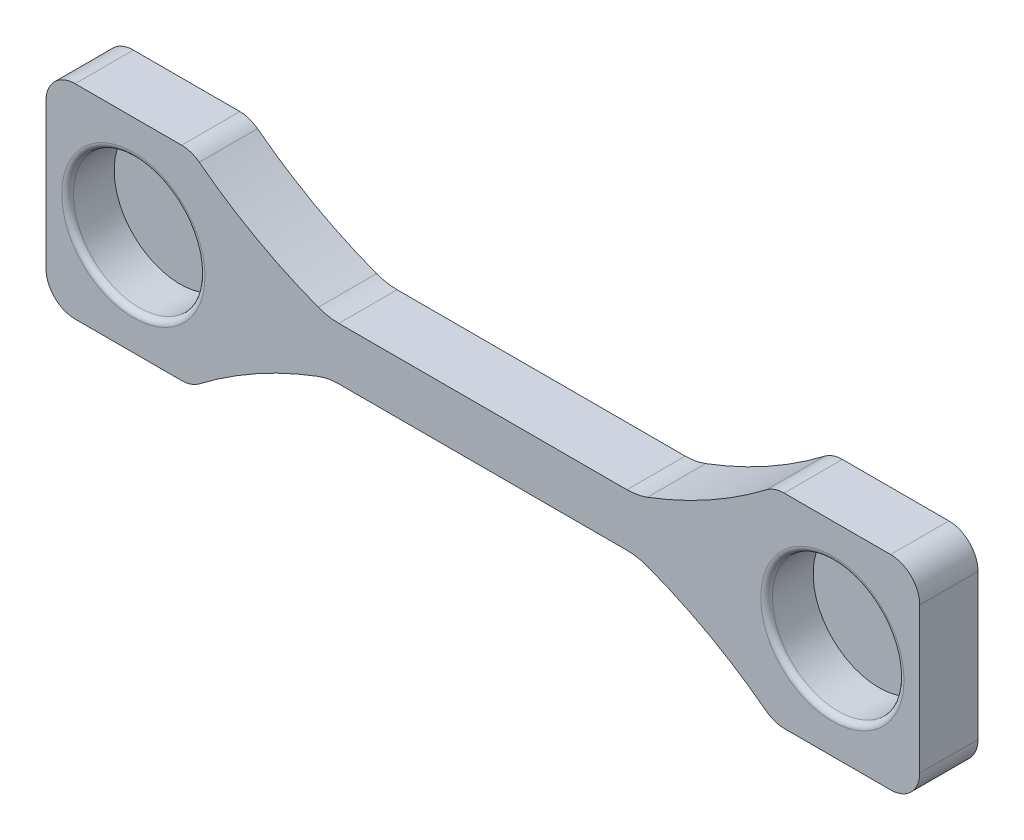
ISO-10303-21;
HEADER;
FILE_DESCRIPTION(('STEP AP214'),'2;1');
FILE_NAME('part.step','',(''),(''),'','','');
FILE_SCHEMA(('AUTOMOTIVE_DESIGN { 1 0 10303 214 1 1 1 1 }'));
ENDSEC;
DATA;
#1=APPLICATION_CONTEXT('core data for automotive mechanical design processes');
#2=APPLICATION_PROTOCOL_DEFINITION('international standard','automotive_design',2000,#1);
#3=PRODUCT_CONTEXT('',#1,'mechanical');
#4=PRODUCT('Part','Part','',(#3));
#5=PRODUCT_RELATED_PRODUCT_CATEGORY('part','',(#4));
#6=PRODUCT_DEFINITION_FORMATION('','',#4);
#7=PRODUCT_DEFINITION_CONTEXT('part definition',#1,'design');
#8=PRODUCT_DEFINITION('design','',#6,#7);
#9=PRODUCT_DEFINITION_SHAPE('','',#8);
#10=(LENGTH_UNIT() NAMED_UNIT(*) SI_UNIT(.MILLI.,.METRE.));
#11=(NAMED_UNIT(*) PLANE_ANGLE_UNIT() SI_UNIT($,.RADIAN.));
#12=(NAMED_UNIT(*) SI_UNIT($,.STERADIAN.) SOLID_ANGLE_UNIT());
#13=UNCERTAINTY_MEASURE_WITH_UNIT(LENGTH_MEASURE(1.E-05),#10,'distance_accuracy_value','');
#14=(GEOMETRIC_REPRESENTATION_CONTEXT(3) GLOBAL_UNCERTAINTY_ASSIGNED_CONTEXT((#13)) GLOBAL_UNIT_ASSIGNED_CONTEXT((#10,
#11,#12)) REPRESENTATION_CONTEXT('',''));
#15=CARTESIAN_POINT('',(0.,0.,0.));
#16=DIRECTION('',(0.,0.,1.));
#17=DIRECTION('',(1.,0.,0.));
#18=AXIS2_PLACEMENT_3D('',#15,#16,#17);
#19=CARTESIAN_POINT('',(0.,0.,10.));
#20=DIRECTION('',(0.,0.,1.));
#21=DIRECTION('',(1.,0.,0.));
#22=AXIS2_PLACEMENT_3D('',#19,#20,#21);
#23=PLANE('',#22);
#24=CARTESIAN_POINT('',(60.,0.,10.));
#25=DIRECTION('',(0.,0.,1.));
#26=DIRECTION('',(1.,0.,0.));
#27=AXIS2_PLACEMENT_3D('',#24,#25,#26);
#28=CIRCLE('',#27,12.3);
#29=CARTESIAN_POINT('',(72.3,0.,10.));
#30=VERTEX_POINT('',#29);
#31=EDGE_CURVE('E42',#30,#30,#28,.F.);
#32=ORIENTED_EDGE('',*,*,#31,.T.);
#33=EDGE_LOOP('',(#32));
#34=FACE_BOUND('',#33,.T.);
#35=CARTESIAN_POINT('',(-60.,0.,10.));
#36=DIRECTION('',(0.,0.,1.));
#37=DIRECTION('',(1.,0.,0.));
#38=AXIS2_PLACEMENT_3D('',#35,#36,#37);
#39=CIRCLE('',#38,12.3);
#40=CARTESIAN_POINT('',(-47.7,0.,10.));
#41=VERTEX_POINT('',#40);
#42=EDGE_CURVE('E388',#41,#41,#39,.F.);
#43=ORIENTED_EDGE('',*,*,#42,.T.);
#44=EDGE_LOOP('',(#43));
#45=FACE_BOUND('',#44,.T.);
#46=CARTESIAN_POINT('',(0.,80.1785714285714,10.));
#47=DIRECTION('',(0.,0.,1.));
#48=DIRECTION('',(1.,0.,0.));
#49=AXIS2_PLACEMENT_3D('',#46,#47,#48);
#50=CIRCLE('',#49,80.1785714285714);
#51=CARTESIAN_POINT('',(-28.2530006214216,5.14277149139154,10.));
#52=VERTEX_POINT('',#51);
#53=CARTESIAN_POINT('',(-48.6844037140679,16.4727463312369,10.));
#54=VERTEX_POINT('',#53);
#55=EDGE_CURVE('E237',#52,#54,#50,.F.);
#56=ORIENTED_EDGE('',*,*,#55,.T.);
#57=CARTESIAN_POINT('',(-51.720402163943,12.5,10.));
#58=DIRECTION('',(0.,0.,1.));
#59=DIRECTION('',(1.,0.,0.));
#60=AXIS2_PLACEMENT_3D('',#57,#58,#59);
#61=CIRCLE('',#60,5.);
#62=CARTESIAN_POINT('',(-51.720402163943,17.5,10.));
#63=VERTEX_POINT('',#62);
#64=EDGE_CURVE('E334',#54,#63,#61,.T.);
#65=ORIENTED_EDGE('',*,*,#64,.T.);
#66=DIRECTION('',(-1.,0.,0.));
#67=VECTOR('',#66,1.);
#68=CARTESIAN_POINT('',(75.,17.5,10.));
#69=LINE('',#68,#67);
#70=CARTESIAN_POINT('',(-70.,17.5,10.));
#71=VERTEX_POINT('',#70);
#72=EDGE_CURVE('E302',#63,#71,#69,.T.);
#73=ORIENTED_EDGE('',*,*,#72,.T.);
#74=CARTESIAN_POINT('',(-70.,12.5,10.));
#75=DIRECTION('',(0.,0.,1.));
#76=DIRECTION('',(1.,0.,0.));
#77=AXIS2_PLACEMENT_3D('',#74,#75,#76);
#78=CIRCLE('',#77,5.);
#79=CARTESIAN_POINT('',(-75.,12.5,10.));
#80=VERTEX_POINT('',#79);
#81=EDGE_CURVE('E322',#71,#80,#78,.T.);
#82=ORIENTED_EDGE('',*,*,#81,.T.);
#83=DIRECTION('',(0.,-1.,0.));
#84=VECTOR('',#83,1.);
#85=CARTESIAN_POINT('',(-75.,-17.5,10.));
#86=LINE('',#85,#84);
#87=CARTESIAN_POINT('',(-75.,-12.5,10.));
#88=VERTEX_POINT('',#87);
#89=EDGE_CURVE('E291',#80,#88,#86,.T.);
#90=ORIENTED_EDGE('',*,*,#89,.T.);
#91=CARTESIAN_POINT('',(-70.,-12.5,10.));
#92=DIRECTION('',(0.,0.,1.));
#93=DIRECTION('',(1.,0.,0.));
#94=AXIS2_PLACEMENT_3D('',#91,#92,#93);
#95=CIRCLE('',#94,5.);
#96=CARTESIAN_POINT('',(-70.,-17.5,10.));
#97=VERTEX_POINT('',#96);
#98=EDGE_CURVE('E320',#88,#97,#95,.T.);
#99=ORIENTED_EDGE('',*,*,#98,.T.);
#100=DIRECTION('',(1.,0.,0.));
#101=VECTOR('',#100,1.);
#102=CARTESIAN_POINT('',(75.,-17.5,10.));
#103=LINE('',#102,#101);
#104=CARTESIAN_POINT('',(-51.720402163943,-17.5,10.));
#105=VERTEX_POINT('',#104);
#106=EDGE_CURVE('E298',#97,#105,#103,.T.);
#107=ORIENTED_EDGE('',*,*,#106,.T.);
#108=CARTESIAN_POINT('',(-51.720402163943,-12.5,10.));
#109=DIRECTION('',(0.,0.,1.));
#110=DIRECTION('',(1.,0.,0.));
#111=AXIS2_PLACEMENT_3D('',#108,#109,#110);
#112=CIRCLE('',#111,5.);
#113=CARTESIAN_POINT('',(-48.684403714068,-16.4727463312369,10.));
#114=VERTEX_POINT('',#113);
#115=EDGE_CURVE('E332',#105,#114,#112,.T.);
#116=ORIENTED_EDGE('',*,*,#115,.T.);
#117=CARTESIAN_POINT('',(0.,-80.1785714285714,10.));
#118=DIRECTION('',(0.,0.,1.));
#119=DIRECTION('',(1.,0.,0.));
#120=AXIS2_PLACEMENT_3D('',#117,#118,#119);
#121=CIRCLE('',#120,80.1785714285714);
#122=CARTESIAN_POINT('',(-28.2530006214216,-5.14277149139156,10.));
#123=VERTEX_POINT('',#122);
#124=EDGE_CURVE('E266',#123,#114,#121,.T.);
#125=ORIENTED_EDGE('',*,*,#124,.F.);
#126=CARTESIAN_POINT('',(-24.729241078438,-14.5013567842247,10.));
#127=DIRECTION('',(0.,0.,1.));
#128=DIRECTION('',(1.,0.,0.));
#129=AXIS2_PLACEMENT_3D('',#126,#127,#128);
#130=CIRCLE('',#129,10.);
#131=CARTESIAN_POINT('',(-24.729241078438,-4.50135678422468,10.));
#132=VERTEX_POINT('',#131);
#133=EDGE_CURVE('E244',#132,#123,#130,.T.);
#134=ORIENTED_EDGE('',*,*,#133,.F.);
#135=DIRECTION('',(1.,0.,0.));
#136=VECTOR('',#135,1.);
#137=CARTESIAN_POINT('',(0.,-4.50135678422468,10.));
#138=LINE('',#137,#136);
#139=CARTESIAN_POINT('',(24.729241078438,-4.50135678422468,10.));
#140=VERTEX_POINT('',#139);
#141=EDGE_CURVE('E252',#132,#140,#138,.T.);
#142=ORIENTED_EDGE('',*,*,#141,.T.);
#143=CARTESIAN_POINT('',(24.729241078438,-14.5013567842247,10.));
#144=DIRECTION('',(0.,0.,1.));
#145=DIRECTION('',(1.,0.,0.));
#146=AXIS2_PLACEMENT_3D('',#143,#144,#145);
#147=CIRCLE('',#146,10.);
#148=CARTESIAN_POINT('',(28.2530006214216,-5.14277149139156,10.));
#149=VERTEX_POINT('',#148);
#150=EDGE_CURVE('E272',#149,#140,#147,.T.);
#151=ORIENTED_EDGE('',*,*,#150,.F.);
#152=CARTESIAN_POINT('',(0.,-80.1785714285714,10.));
#153=DIRECTION('',(0.,0.,1.));
#154=DIRECTION('',(1.,0.,0.));
#155=AXIS2_PLACEMENT_3D('',#152,#153,#154);
#156=CIRCLE('',#155,80.1785714285714);
#157=CARTESIAN_POINT('',(48.6844037140679,-16.4727463312369,10.));
#158=VERTEX_POINT('',#157);
#159=EDGE_CURVE('E269',#149,#158,#156,.F.);
#160=ORIENTED_EDGE('',*,*,#159,.T.);
#161=CARTESIAN_POINT('',(51.720402163943,-12.5,10.));
#162=DIRECTION('',(0.,0.,1.));
#163=DIRECTION('',(1.,0.,0.));
#164=AXIS2_PLACEMENT_3D('',#161,#162,#163);
#165=CIRCLE('',#164,5.);
#166=CARTESIAN_POINT('',(51.720402163943,-17.5,10.));
#167=VERTEX_POINT('',#166);
#168=EDGE_CURVE('E330',#158,#167,#165,.T.);
#169=ORIENTED_EDGE('',*,*,#168,.T.);
#170=CARTESIAN_POINT('',(70.,-17.5,10.));
#171=VERTEX_POINT('',#170);
#172=EDGE_CURVE('E294',#167,#171,#103,.T.);
#173=ORIENTED_EDGE('',*,*,#172,.T.);
#174=CARTESIAN_POINT('',(70.,-12.5,10.));
#175=DIRECTION('',(0.,0.,1.));
#176=DIRECTION('',(1.,0.,0.));
#177=AXIS2_PLACEMENT_3D('',#174,#175,#176);
#178=CIRCLE('',#177,5.);
#179=CARTESIAN_POINT('',(75.,-12.5,10.));
#180=VERTEX_POINT('',#179);
#181=EDGE_CURVE('E324',#171,#180,#178,.T.);
#182=ORIENTED_EDGE('',*,*,#181,.T.);
#183=DIRECTION('',(0.,1.,0.));
#184=VECTOR('',#183,1.);
#185=CARTESIAN_POINT('',(75.,-17.5,10.));
#186=LINE('',#185,#184);
#187=CARTESIAN_POINT('',(75.,12.5,10.));
#188=VERTEX_POINT('',#187);
#189=EDGE_CURVE('E299',#180,#188,#186,.T.);
#190=ORIENTED_EDGE('',*,*,#189,.T.);
#191=CARTESIAN_POINT('',(70.,12.5,10.));
#192=DIRECTION('',(0.,0.,1.));
#193=DIRECTION('',(1.,0.,0.));
#194=AXIS2_PLACEMENT_3D('',#191,#192,#193);
#195=CIRCLE('',#194,5.);
#196=CARTESIAN_POINT('',(70.,17.5,10.));
#197=VERTEX_POINT('',#196);
#198=EDGE_CURVE('E326',#188,#197,#195,.T.);
#199=ORIENTED_EDGE('',*,*,#198,.T.);
#200=CARTESIAN_POINT('',(51.720402163943,17.5,10.));
#201=VERTEX_POINT('',#200);
#202=EDGE_CURVE('E303',#197,#201,#69,.T.);
#203=ORIENTED_EDGE('',*,*,#202,.T.);
#204=CARTESIAN_POINT('',(51.720402163943,12.5,10.));
#205=DIRECTION('',(0.,0.,1.));
#206=DIRECTION('',(1.,0.,0.));
#207=AXIS2_PLACEMENT_3D('',#204,#205,#206);
#208=CIRCLE('',#207,5.);
#209=CARTESIAN_POINT('',(48.6844037140679,16.4727463312369,10.));
#210=VERTEX_POINT('',#209);
#211=EDGE_CURVE('E328',#201,#210,#208,.T.);
#212=ORIENTED_EDGE('',*,*,#211,.T.);
#213=CARTESIAN_POINT('',(0.,80.1785714285714,10.));
#214=DIRECTION('',(0.,0.,1.));
#215=DIRECTION('',(1.,0.,0.));
#216=AXIS2_PLACEMENT_3D('',#213,#214,#215);
#217=CIRCLE('',#216,80.1785714285714);
#218=CARTESIAN_POINT('',(28.2530006214215,5.14277149139154,10.));
#219=VERTEX_POINT('',#218);
#220=EDGE_CURVE('E235',#219,#210,#217,.T.);
#221=ORIENTED_EDGE('',*,*,#220,.F.);
#222=CARTESIAN_POINT('',(24.729241078438,14.5013567842247,10.));
#223=DIRECTION('',(0.,0.,1.));
#224=DIRECTION('',(1.,0.,0.));
#225=AXIS2_PLACEMENT_3D('',#222,#223,#224);
#226=CIRCLE('',#225,10.);
#227=CARTESIAN_POINT('',(24.729241078438,4.50135678422468,10.));
#228=VERTEX_POINT('',#227);
#229=EDGE_CURVE('E203',#219,#228,#226,.F.);
#230=ORIENTED_EDGE('',*,*,#229,.T.);
#231=DIRECTION('',(1.,0.,0.));
#232=VECTOR('',#231,1.);
#233=CARTESIAN_POINT('',(0.,4.50135678422468,10.));
#234=LINE('',#233,#232);
#235=CARTESIAN_POINT('',(-24.729241078438,4.50135678422468,10.));
#236=VERTEX_POINT('',#235);
#237=EDGE_CURVE('E223',#236,#228,#234,.T.);
#238=ORIENTED_EDGE('',*,*,#237,.F.);
#239=CARTESIAN_POINT('',(-24.729241078438,14.5013567842247,10.));
#240=DIRECTION('',(0.,0.,1.));
#241=DIRECTION('',(1.,0.,0.));
#242=AXIS2_PLACEMENT_3D('',#239,#240,#241);
#243=CIRCLE('',#242,10.);
#244=EDGE_CURVE('E226',#236,#52,#243,.F.);
#245=ORIENTED_EDGE('',*,*,#244,.T.);
#246=EDGE_LOOP('',(#56,#65,#73,#82,#90,#99,#107,#116,#125,#134,#142,#151,#160,#169,#173,#182,
#190,#199,#203,#212,#221,#230,#238,#245));
#247=FACE_BOUND('',#246,.T.);
#248=ADVANCED_FACE('F34',(#34,#45,#247),#23,.T.);
#249=CARTESIAN_POINT('',(0.,0.,0.));
#250=DIRECTION('',(0.,0.,1.));
#251=DIRECTION('',(1.,0.,0.));
#252=AXIS2_PLACEMENT_3D('',#249,#250,#251);
#253=PLANE('',#252);
#254=DIRECTION('',(-1.,0.,0.));
#255=VECTOR('',#254,1.);
#256=CARTESIAN_POINT('',(75.,17.5,0.));
#257=LINE('',#256,#255);
#258=CARTESIAN_POINT('',(-51.720402163943,17.5,0.));
#259=VERTEX_POINT('',#258);
#260=CARTESIAN_POINT('',(-70.,17.5,0.));
#261=VERTEX_POINT('',#260);
#262=EDGE_CURVE('E315',#259,#261,#257,.T.);
#263=ORIENTED_EDGE('',*,*,#262,.F.);
#264=CARTESIAN_POINT('',(-51.720402163943,12.5,0.));
#265=DIRECTION('',(0.,0.,1.));
#266=DIRECTION('',(1.,0.,0.));
#267=AXIS2_PLACEMENT_3D('',#264,#265,#266);
#268=CIRCLE('',#267,5.);
#269=CARTESIAN_POINT('',(-48.6844037140679,16.4727463312369,0.));
#270=VERTEX_POINT('',#269);
#271=EDGE_CURVE('E352',#259,#270,#268,.F.);
#272=ORIENTED_EDGE('',*,*,#271,.T.);
#273=CARTESIAN_POINT('',(0.,80.1785714285714,0.));
#274=DIRECTION('',(0.,0.,1.));
#275=DIRECTION('',(1.,0.,0.));
#276=AXIS2_PLACEMENT_3D('',#273,#274,#275);
#277=CIRCLE('',#276,80.1785714285714);
#278=CARTESIAN_POINT('',(-28.2530006214216,5.14277149139154,0.));
#279=VERTEX_POINT('',#278);
#280=EDGE_CURVE('E216',#279,#270,#277,.F.);
#281=ORIENTED_EDGE('',*,*,#280,.F.);
#282=CARTESIAN_POINT('',(-24.729241078438,14.5013567842247,0.));
#283=DIRECTION('',(0.,0.,1.));
#284=DIRECTION('',(1.,0.,0.));
#285=AXIS2_PLACEMENT_3D('',#282,#283,#284);
#286=CIRCLE('',#285,10.);
#287=CARTESIAN_POINT('',(-24.729241078438,4.50135678422468,0.));
#288=VERTEX_POINT('',#287);
#289=EDGE_CURVE('E231',#288,#279,#286,.F.);
#290=ORIENTED_EDGE('',*,*,#289,.F.);
#291=DIRECTION('',(1.,0.,0.));
#292=VECTOR('',#291,1.);
#293=CARTESIAN_POINT('',(0.,4.50135678422468,0.));
#294=LINE('',#293,#292);
#295=CARTESIAN_POINT('',(24.729241078438,4.50135678422468,0.));
#296=VERTEX_POINT('',#295);
#297=EDGE_CURVE('E208',#288,#296,#294,.T.);
#298=ORIENTED_EDGE('',*,*,#297,.T.);
#299=CARTESIAN_POINT('',(24.729241078438,14.5013567842247,0.));
#300=DIRECTION('',(0.,0.,1.));
#301=DIRECTION('',(1.,0.,0.));
#302=AXIS2_PLACEMENT_3D('',#299,#300,#301);
#303=CIRCLE('',#302,10.);
#304=CARTESIAN_POINT('',(28.2530006214215,5.14277149139154,0.));
#305=VERTEX_POINT('',#304);
#306=EDGE_CURVE('E200',#305,#296,#303,.F.);
#307=ORIENTED_EDGE('',*,*,#306,.F.);
#308=CARTESIAN_POINT('',(0.,80.1785714285714,0.));
#309=DIRECTION('',(0.,0.,1.));
#310=DIRECTION('',(1.,0.,0.));
#311=AXIS2_PLACEMENT_3D('',#308,#309,#310);
#312=CIRCLE('',#311,80.1785714285714);
#313=CARTESIAN_POINT('',(48.6844037140679,16.4727463312369,0.));
#314=VERTEX_POINT('',#313);
#315=EDGE_CURVE('E211',#305,#314,#312,.T.);
#316=ORIENTED_EDGE('',*,*,#315,.T.);
#317=CARTESIAN_POINT('',(51.720402163943,12.5,0.));
#318=DIRECTION('',(0.,0.,1.));
#319=DIRECTION('',(1.,0.,0.));
#320=AXIS2_PLACEMENT_3D('',#317,#318,#319);
#321=CIRCLE('',#320,5.);
#322=CARTESIAN_POINT('',(51.720402163943,17.5,0.));
#323=VERTEX_POINT('',#322);
#324=EDGE_CURVE('E346',#314,#323,#321,.F.);
#325=ORIENTED_EDGE('',*,*,#324,.T.);
#326=CARTESIAN_POINT('',(70.,17.5,0.));
#327=VERTEX_POINT('',#326);
#328=EDGE_CURVE('E295',#327,#323,#257,.T.);
#329=ORIENTED_EDGE('',*,*,#328,.F.);
#330=CARTESIAN_POINT('',(70.,12.5,0.));
#331=DIRECTION('',(0.,0.,1.));
#332=DIRECTION('',(1.,0.,0.));
#333=AXIS2_PLACEMENT_3D('',#330,#331,#332);
#334=CIRCLE('',#333,5.);
#335=CARTESIAN_POINT('',(75.,12.5,0.));
#336=VERTEX_POINT('',#335);
#337=EDGE_CURVE('E344',#327,#336,#334,.F.);
#338=ORIENTED_EDGE('',*,*,#337,.T.);
#339=DIRECTION('',(0.,1.,0.));
#340=VECTOR('',#339,1.);
#341=CARTESIAN_POINT('',(75.,-17.5,0.));
#342=LINE('',#341,#340);
#343=CARTESIAN_POINT('',(75.,-12.5,0.));
#344=VERTEX_POINT('',#343);
#345=EDGE_CURVE('E312',#344,#336,#342,.T.);
#346=ORIENTED_EDGE('',*,*,#345,.F.);
#347=CARTESIAN_POINT('',(70.,-12.5,0.));
#348=DIRECTION('',(0.,0.,1.));
#349=DIRECTION('',(1.,0.,0.));
#350=AXIS2_PLACEMENT_3D('',#347,#348,#349);
#351=CIRCLE('',#350,5.);
#352=CARTESIAN_POINT('',(70.,-17.5,0.));
#353=VERTEX_POINT('',#352);
#354=EDGE_CURVE('E342',#344,#353,#351,.F.);
#355=ORIENTED_EDGE('',*,*,#354,.T.);
#356=DIRECTION('',(1.,0.,0.));
#357=VECTOR('',#356,1.);
#358=CARTESIAN_POINT('',(75.,-17.5,0.));
#359=LINE('',#358,#357);
#360=CARTESIAN_POINT('',(51.720402163943,-17.5,0.));
#361=VERTEX_POINT('',#360);
#362=EDGE_CURVE('E308',#361,#353,#359,.T.);
#363=ORIENTED_EDGE('',*,*,#362,.F.);
#364=CARTESIAN_POINT('',(51.720402163943,-12.5,0.));
#365=DIRECTION('',(0.,0.,1.));
#366=DIRECTION('',(1.,0.,0.));
#367=AXIS2_PLACEMENT_3D('',#364,#365,#366);
#368=CIRCLE('',#367,5.);
#369=CARTESIAN_POINT('',(48.6844037140679,-16.4727463312369,0.));
#370=VERTEX_POINT('',#369);
#371=EDGE_CURVE('E348',#361,#370,#368,.F.);
#372=ORIENTED_EDGE('',*,*,#371,.T.);
#373=CARTESIAN_POINT('',(0.,-80.1785714285714,0.));
#374=DIRECTION('',(0.,0.,1.));
#375=DIRECTION('',(1.,0.,0.));
#376=AXIS2_PLACEMENT_3D('',#373,#374,#375);
#377=CIRCLE('',#376,80.1785714285714);
#378=CARTESIAN_POINT('',(28.2530006214216,-5.14277149139156,0.));
#379=VERTEX_POINT('',#378);
#380=EDGE_CURVE('E255',#379,#370,#377,.F.);
#381=ORIENTED_EDGE('',*,*,#380,.F.);
#382=CARTESIAN_POINT('',(24.729241078438,-14.5013567842247,0.));
#383=DIRECTION('',(0.,0.,1.));
#384=DIRECTION('',(1.,0.,0.));
#385=AXIS2_PLACEMENT_3D('',#382,#383,#384);
#386=CIRCLE('',#385,10.);
#387=CARTESIAN_POINT('',(24.729241078438,-4.50135678422468,0.));
#388=VERTEX_POINT('',#387);
#389=EDGE_CURVE('E258',#379,#388,#386,.T.);
#390=ORIENTED_EDGE('',*,*,#389,.T.);
#391=DIRECTION('',(1.,0.,0.));
#392=VECTOR('',#391,1.);
#393=CARTESIAN_POINT('',(0.,-4.50135678422468,0.));
#394=LINE('',#393,#392);
#395=CARTESIAN_POINT('',(-24.729241078438,-4.50135678422468,0.));
#396=VERTEX_POINT('',#395);
#397=EDGE_CURVE('E261',#396,#388,#394,.T.);
#398=ORIENTED_EDGE('',*,*,#397,.F.);
#399=CARTESIAN_POINT('',(-24.729241078438,-14.5013567842247,0.));
#400=DIRECTION('',(0.,0.,1.));
#401=DIRECTION('',(1.,0.,0.));
#402=AXIS2_PLACEMENT_3D('',#399,#400,#401);
#403=CIRCLE('',#402,10.);
#404=CARTESIAN_POINT('',(-28.2530006214216,-5.14277149139156,0.));
#405=VERTEX_POINT('',#404);
#406=EDGE_CURVE('E248',#396,#405,#403,.T.);
#407=ORIENTED_EDGE('',*,*,#406,.T.);
#408=CARTESIAN_POINT('',(0.,-80.1785714285714,0.));
#409=DIRECTION('',(0.,0.,1.));
#410=DIRECTION('',(1.,0.,0.));
#411=AXIS2_PLACEMENT_3D('',#408,#409,#410);
#412=CIRCLE('',#411,80.1785714285714);
#413=CARTESIAN_POINT('',(-48.684403714068,-16.4727463312369,0.));
#414=VERTEX_POINT('',#413);
#415=EDGE_CURVE('E251',#405,#414,#412,.T.);
#416=ORIENTED_EDGE('',*,*,#415,.T.);
#417=CARTESIAN_POINT('',(-51.720402163943,-12.5,0.));
#418=DIRECTION('',(0.,0.,1.));
#419=DIRECTION('',(1.,0.,0.));
#420=AXIS2_PLACEMENT_3D('',#417,#418,#419);
#421=CIRCLE('',#420,5.);
#422=CARTESIAN_POINT('',(-51.720402163943,-17.5,0.));
#423=VERTEX_POINT('',#422);
#424=EDGE_CURVE('E350',#414,#423,#421,.F.);
#425=ORIENTED_EDGE('',*,*,#424,.T.);
#426=CARTESIAN_POINT('',(-70.,-17.5,0.));
#427=VERTEX_POINT('',#426);
#428=EDGE_CURVE('E309',#427,#423,#359,.T.);
#429=ORIENTED_EDGE('',*,*,#428,.F.);
#430=CARTESIAN_POINT('',(-70.,-12.5,0.));
#431=DIRECTION('',(0.,0.,1.));
#432=DIRECTION('',(1.,0.,0.));
#433=AXIS2_PLACEMENT_3D('',#430,#431,#432);
#434=CIRCLE('',#433,5.);
#435=CARTESIAN_POINT('',(-75.,-12.5,0.));
#436=VERTEX_POINT('',#435);
#437=EDGE_CURVE('E49',#427,#436,#434,.F.);
#438=ORIENTED_EDGE('',*,*,#437,.T.);
#439=DIRECTION('',(0.,-1.,0.));
#440=VECTOR('',#439,1.);
#441=CARTESIAN_POINT('',(-75.,-17.5,0.));
#442=LINE('',#441,#440);
#443=CARTESIAN_POINT('',(-75.,12.5,0.));
#444=VERTEX_POINT('',#443);
#445=EDGE_CURVE('E290',#444,#436,#442,.T.);
#446=ORIENTED_EDGE('',*,*,#445,.F.);
#447=CARTESIAN_POINT('',(-70.,12.5,0.));
#448=DIRECTION('',(0.,0.,1.));
#449=DIRECTION('',(1.,0.,0.));
#450=AXIS2_PLACEMENT_3D('',#447,#448,#449);
#451=CIRCLE('',#450,5.);
#452=EDGE_CURVE('E57',#444,#261,#451,.F.);
#453=ORIENTED_EDGE('',*,*,#452,.T.);
#454=EDGE_LOOP('',(#263,#272,#281,#290,#298,#307,#316,#325,#329,#338,#346,#355,#363,#372,#381,
#390,#398,#407,#416,#425,#429,#438,#446,#453));
#455=FACE_BOUND('',#454,.T.);
#456=ADVANCED_FACE('F220',(#455),#253,.F.);
#457=CARTESIAN_POINT('',(75.,17.5,10.));
#458=DIRECTION('',(0.,-1.,0.));
#459=DIRECTION('',(1.,0.,0.));
#460=AXIS2_PLACEMENT_3D('',#457,#458,#459);
#461=PLANE('',#460);
#462=ORIENTED_EDGE('',*,*,#72,.F.);
#463=DIRECTION('',(0.,0.,-1.));
#464=VECTOR('',#463,1.);
#465=CARTESIAN_POINT('',(-51.720402163943,17.5,0.));
#466=LINE('',#465,#464);
#467=EDGE_CURVE('E338',#63,#259,#466,.T.);
#468=ORIENTED_EDGE('',*,*,#467,.T.);
#469=ORIENTED_EDGE('',*,*,#262,.T.);
#470=DIRECTION('',(0.,0.,-1.));
#471=VECTOR('',#470,1.);
#472=CARTESIAN_POINT('',(-70.,17.5,10.));
#473=LINE('',#472,#471);
#474=EDGE_CURVE('E336',#261,#71,#473,.F.);
#475=ORIENTED_EDGE('',*,*,#474,.T.);
#476=EDGE_LOOP('',(#462,#468,#469,#475));
#477=FACE_BOUND('',#476,.T.);
#478=ADVANCED_FACE('F425',(#477),#461,.F.);
#479=CARTESIAN_POINT('',(75.,-17.5,10.));
#480=DIRECTION('',(0.,1.,0.));
#481=DIRECTION('',(-1.,0.,0.));
#482=AXIS2_PLACEMENT_3D('',#479,#480,#481);
#483=PLANE('',#482);
#484=ORIENTED_EDGE('',*,*,#172,.F.);
#485=DIRECTION('',(0.,0.,-1.));
#486=VECTOR('',#485,1.);
#487=CARTESIAN_POINT('',(51.720402163943,-17.5,0.));
#488=LINE('',#487,#486);
#489=EDGE_CURVE('E367',#167,#361,#488,.T.);
#490=ORIENTED_EDGE('',*,*,#489,.T.);
#491=ORIENTED_EDGE('',*,*,#362,.T.);
#492=DIRECTION('',(0.,0.,-1.));
#493=VECTOR('',#492,1.);
#494=CARTESIAN_POINT('',(70.,-17.5,10.));
#495=LINE('',#494,#493);
#496=EDGE_CURVE('E365',#353,#171,#495,.F.);
#497=ORIENTED_EDGE('',*,*,#496,.T.);
#498=EDGE_LOOP('',(#484,#490,#491,#497));
#499=FACE_BOUND('',#498,.T.);
#500=ADVANCED_FACE('F444',(#499),#483,.F.);
#501=CARTESIAN_POINT('',(-75.,-17.5,10.));
#502=DIRECTION('',(1.,0.,0.));
#503=DIRECTION('',(0.,0.,-1.));
#504=AXIS2_PLACEMENT_3D('',#501,#502,#503);
#505=PLANE('',#504);
#506=ORIENTED_EDGE('',*,*,#89,.F.);
#507=DIRECTION('',(0.,0.,-1.));
#508=VECTOR('',#507,1.);
#509=CARTESIAN_POINT('',(-75.,12.5,10.));
#510=LINE('',#509,#508);
#511=EDGE_CURVE('E383',#80,#444,#510,.T.);
#512=ORIENTED_EDGE('',*,*,#511,.T.);
#513=ORIENTED_EDGE('',*,*,#445,.T.);
#514=DIRECTION('',(0.,0.,-1.));
#515=VECTOR('',#514,1.);
#516=CARTESIAN_POINT('',(-75.,-12.5,10.));
#517=LINE('',#516,#515);
#518=EDGE_CURVE('E381',#436,#88,#517,.F.);
#519=ORIENTED_EDGE('',*,*,#518,.T.);
#520=EDGE_LOOP('',(#506,#512,#513,#519));
#521=FACE_BOUND('',#520,.T.);
#522=ADVANCED_FACE('F442',(#521),#505,.F.);
#523=ORIENTED_EDGE('',*,*,#428,.T.);
#524=DIRECTION('',(0.,0.,1.));
#525=VECTOR('',#524,1.);
#526=CARTESIAN_POINT('',(-51.720402163943,-17.5,10.));
#527=LINE('',#526,#525);
#528=EDGE_CURVE('E357',#423,#105,#527,.T.);
#529=ORIENTED_EDGE('',*,*,#528,.T.);
#530=ORIENTED_EDGE('',*,*,#106,.F.);
#531=DIRECTION('',(0.,0.,-1.));
#532=VECTOR('',#531,1.);
#533=CARTESIAN_POINT('',(-70.,-17.5,10.));
#534=LINE('',#533,#532);
#535=EDGE_CURVE('E354',#97,#427,#534,.T.);
#536=ORIENTED_EDGE('',*,*,#535,.T.);
#537=EDGE_LOOP('',(#523,#529,#530,#536));
#538=FACE_BOUND('',#537,.T.);
#539=ADVANCED_FACE('F438',(#538),#483,.F.);
#540=CARTESIAN_POINT('',(75.,-17.5,10.));
#541=DIRECTION('',(-1.,0.,0.));
#542=DIRECTION('',(0.,0.,1.));
#543=AXIS2_PLACEMENT_3D('',#540,#541,#542);
#544=PLANE('',#543);
#545=ORIENTED_EDGE('',*,*,#345,.T.);
#546=DIRECTION('',(0.,0.,-1.));
#547=VECTOR('',#546,1.);
#548=CARTESIAN_POINT('',(75.,12.5,10.));
#549=LINE('',#548,#547);
#550=EDGE_CURVE('E379',#336,#188,#549,.F.);
#551=ORIENTED_EDGE('',*,*,#550,.T.);
#552=ORIENTED_EDGE('',*,*,#189,.F.);
#553=DIRECTION('',(0.,0.,-1.));
#554=VECTOR('',#553,1.);
#555=CARTESIAN_POINT('',(75.,-12.5,10.));
#556=LINE('',#555,#554);
#557=EDGE_CURVE('E376',#180,#344,#556,.T.);
#558=ORIENTED_EDGE('',*,*,#557,.T.);
#559=EDGE_LOOP('',(#545,#551,#552,#558));
#560=FACE_BOUND('',#559,.T.);
#561=ADVANCED_FACE('F434',(#560),#544,.F.);
#562=ORIENTED_EDGE('',*,*,#328,.T.);
#563=DIRECTION('',(0.,0.,1.));
#564=VECTOR('',#563,1.);
#565=CARTESIAN_POINT('',(51.720402163943,17.5,10.));
#566=LINE('',#565,#564);
#567=EDGE_CURVE('E372',#323,#201,#566,.T.);
#568=ORIENTED_EDGE('',*,*,#567,.T.);
#569=ORIENTED_EDGE('',*,*,#202,.F.);
#570=DIRECTION('',(0.,0.,-1.));
#571=VECTOR('',#570,1.);
#572=CARTESIAN_POINT('',(70.,17.5,10.));
#573=LINE('',#572,#571);
#574=EDGE_CURVE('E369',#197,#327,#573,.T.);
#575=ORIENTED_EDGE('',*,*,#574,.T.);
#576=EDGE_LOOP('',(#562,#568,#569,#575));
#577=FACE_BOUND('',#576,.T.);
#578=ADVANCED_FACE('F431',(#577),#461,.F.);
#579=CARTESIAN_POINT('',(-60.,0.,2.));
#580=DIRECTION('',(0.,0.,1.));
#581=DIRECTION('',(1.,0.,0.));
#582=AXIS2_PLACEMENT_3D('',#579,#580,#581);
#583=CYLINDRICAL_SURFACE('',#582,11.3);
#584=CARTESIAN_POINT('',(-60.,0.,9.));
#585=DIRECTION('',(0.,0.,1.));
#586=DIRECTION('',(1.,0.,0.));
#587=AXIS2_PLACEMENT_3D('',#584,#585,#586);
#588=CIRCLE('',#587,11.3);
#589=CARTESIAN_POINT('',(-48.7,0.,9.));
#590=VERTEX_POINT('',#589);
#591=EDGE_CURVE('E11',#590,#590,#588,.T.);
#592=ORIENTED_EDGE('',*,*,#591,.T.);
#593=EDGE_LOOP('',(#592));
#594=FACE_BOUND('',#593,.T.);
#595=CARTESIAN_POINT('',(-60.,0.,2.));
#596=DIRECTION('',(0.,0.,1.));
#597=DIRECTION('',(1.,0.,0.));
#598=AXIS2_PLACEMENT_3D('',#595,#596,#597);
#599=CIRCLE('',#598,11.3);
#600=CARTESIAN_POINT('',(-48.7,0.,2.));
#601=VERTEX_POINT('',#600);
#602=EDGE_CURVE('E287',#601,#601,#599,.T.);
#603=ORIENTED_EDGE('',*,*,#602,.F.);
#604=EDGE_LOOP('',(#603));
#605=FACE_BOUND('',#604,.T.);
#606=ADVANCED_FACE('F428',(#594,#605),#583,.F.);
#607=CARTESIAN_POINT('',(-60.,0.,2.));
#608=DIRECTION('',(0.,0.,1.));
#609=DIRECTION('',(1.,0.,0.));
#610=AXIS2_PLACEMENT_3D('',#607,#608,#609);
#611=PLANE('',#610);
#612=ORIENTED_EDGE('',*,*,#602,.T.);
#613=EDGE_LOOP('',(#612));
#614=FACE_BOUND('',#613,.T.);
#615=ADVANCED_FACE('F405',(#614),#611,.T.);
#616=CARTESIAN_POINT('',(60.,0.,2.));
#617=DIRECTION('',(0.,0.,1.));
#618=DIRECTION('',(1.,0.,0.));
#619=AXIS2_PLACEMENT_3D('',#616,#617,#618);
#620=CYLINDRICAL_SURFACE('',#619,11.3);
#621=CARTESIAN_POINT('',(60.,0.,9.));
#622=DIRECTION('',(0.,0.,1.));
#623=DIRECTION('',(1.,0.,0.));
#624=AXIS2_PLACEMENT_3D('',#621,#622,#623);
#625=CIRCLE('',#624,11.3);
#626=CARTESIAN_POINT('',(71.3,0.,9.));
#627=VERTEX_POINT('',#626);
#628=EDGE_CURVE('E385',#627,#627,#625,.T.);
#629=ORIENTED_EDGE('',*,*,#628,.T.);
#630=EDGE_LOOP('',(#629));
#631=FACE_BOUND('',#630,.T.);
#632=CARTESIAN_POINT('',(60.,0.,2.));
#633=DIRECTION('',(0.,0.,1.));
#634=DIRECTION('',(1.,0.,0.));
#635=AXIS2_PLACEMENT_3D('',#632,#633,#634);
#636=CIRCLE('',#635,11.3);
#637=CARTESIAN_POINT('',(71.3,0.,2.));
#638=VERTEX_POINT('',#637);
#639=EDGE_CURVE('E279',#638,#638,#636,.T.);
#640=ORIENTED_EDGE('',*,*,#639,.F.);
#641=EDGE_LOOP('',(#640));
#642=FACE_BOUND('',#641,.T.);
#643=ADVANCED_FACE('F401',(#631,#642),#620,.F.);
#644=CARTESIAN_POINT('',(60.,0.,2.));
#645=DIRECTION('',(0.,0.,1.));
#646=DIRECTION('',(1.,0.,0.));
#647=AXIS2_PLACEMENT_3D('',#644,#645,#646);
#648=PLANE('',#647);
#649=ORIENTED_EDGE('',*,*,#639,.T.);
#650=EDGE_LOOP('',(#649));
#651=FACE_BOUND('',#650,.T.);
#652=ADVANCED_FACE('F404',(#651),#648,.T.);
#653=CARTESIAN_POINT('',(-24.729241078438,-14.5013567842247,0.));
#654=DIRECTION('',(0.,0.,1.));
#655=DIRECTION('',(1.,0.,0.));
#656=AXIS2_PLACEMENT_3D('',#653,#654,#655);
#657=CYLINDRICAL_SURFACE('',#656,10.);
#658=ORIENTED_EDGE('',*,*,#133,.T.);
#659=DIRECTION('',(0.,0.,1.));
#660=VECTOR('',#659,1.);
#661=CARTESIAN_POINT('',(-28.2530006214216,-5.14277149139156,0.));
#662=LINE('',#661,#660);
#663=EDGE_CURVE('E263',#405,#123,#662,.T.);
#664=ORIENTED_EDGE('',*,*,#663,.F.);
#665=ORIENTED_EDGE('',*,*,#406,.F.);
#666=DIRECTION('',(0.,0.,1.));
#667=VECTOR('',#666,1.);
#668=CARTESIAN_POINT('',(-24.729241078438,-4.50135678422468,0.));
#669=LINE('',#668,#667);
#670=EDGE_CURVE('E277',#396,#132,#669,.T.);
#671=ORIENTED_EDGE('',*,*,#670,.T.);
#672=EDGE_LOOP('',(#658,#664,#665,#671));
#673=FACE_BOUND('',#672,.T.);
#674=ADVANCED_FACE('F410',(#673),#657,.F.);
#675=CARTESIAN_POINT('',(0.,-4.50135678422468,0.));
#676=DIRECTION('',(0.,-1.,0.));
#677=DIRECTION('',(0.,0.,-1.));
#678=AXIS2_PLACEMENT_3D('',#675,#676,#677);
#679=PLANE('',#678);
#680=ORIENTED_EDGE('',*,*,#141,.F.);
#681=ORIENTED_EDGE('',*,*,#670,.F.);
#682=ORIENTED_EDGE('',*,*,#397,.T.);
#683=DIRECTION('',(0.,0.,1.));
#684=VECTOR('',#683,1.);
#685=CARTESIAN_POINT('',(24.729241078438,-4.50135678422468,0.));
#686=LINE('',#685,#684);
#687=EDGE_CURVE('E280',#388,#140,#686,.T.);
#688=ORIENTED_EDGE('',*,*,#687,.T.);
#689=EDGE_LOOP('',(#680,#681,#682,#688));
#690=FACE_BOUND('',#689,.T.);
#691=ADVANCED_FACE('F415',(#690),#679,.T.);
#692=CARTESIAN_POINT('',(24.729241078438,-14.5013567842247,0.));
#693=DIRECTION('',(0.,0.,1.));
#694=DIRECTION('',(1.,0.,0.));
#695=AXIS2_PLACEMENT_3D('',#692,#693,#694);
#696=CYLINDRICAL_SURFACE('',#695,10.);
#697=ORIENTED_EDGE('',*,*,#150,.T.);
#698=ORIENTED_EDGE('',*,*,#687,.F.);
#699=ORIENTED_EDGE('',*,*,#389,.F.);
#700=DIRECTION('',(0.,0.,1.));
#701=VECTOR('',#700,1.);
#702=CARTESIAN_POINT('',(28.2530006214216,-5.14277149139156,0.));
#703=LINE('',#702,#701);
#704=EDGE_CURVE('E282',#379,#149,#703,.T.);
#705=ORIENTED_EDGE('',*,*,#704,.T.);
#706=EDGE_LOOP('',(#697,#698,#699,#705));
#707=FACE_BOUND('',#706,.T.);
#708=ADVANCED_FACE('F501',(#707),#696,.F.);
#709=CARTESIAN_POINT('',(0.,-80.1785714285714,0.));
#710=DIRECTION('',(0.,0.,1.));
#711=DIRECTION('',(1.,0.,0.));
#712=AXIS2_PLACEMENT_3D('',#709,#710,#711);
#713=CYLINDRICAL_SURFACE('',#712,80.1785714285714);
#714=ORIENTED_EDGE('',*,*,#380,.T.);
#715=DIRECTION('',(0.,0.,1.));
#716=VECTOR('',#715,1.);
#717=CARTESIAN_POINT('',(48.684403714068,-16.4727463312369,0.));
#718=LINE('',#717,#716);
#719=EDGE_CURVE('E362',#370,#158,#718,.T.);
#720=ORIENTED_EDGE('',*,*,#719,.T.);
#721=ORIENTED_EDGE('',*,*,#159,.F.);
#722=ORIENTED_EDGE('',*,*,#704,.F.);
#723=EDGE_LOOP('',(#714,#720,#721,#722));
#724=FACE_BOUND('',#723,.T.);
#725=ADVANCED_FACE('F505',(#724),#713,.F.);
#726=CARTESIAN_POINT('',(0.,-80.1785714285714,0.));
#727=DIRECTION('',(0.,0.,1.));
#728=DIRECTION('',(1.,0.,0.));
#729=AXIS2_PLACEMENT_3D('',#726,#727,#728);
#730=CYLINDRICAL_SURFACE('',#729,80.1785714285714);
#731=ORIENTED_EDGE('',*,*,#124,.T.);
#732=DIRECTION('',(0.,0.,1.));
#733=VECTOR('',#732,1.);
#734=CARTESIAN_POINT('',(-48.684403714068,-16.4727463312369,0.));
#735=LINE('',#734,#733);
#736=EDGE_CURVE('E360',#114,#414,#735,.F.);
#737=ORIENTED_EDGE('',*,*,#736,.T.);
#738=ORIENTED_EDGE('',*,*,#415,.F.);
#739=ORIENTED_EDGE('',*,*,#663,.T.);
#740=EDGE_LOOP('',(#731,#737,#738,#739));
#741=FACE_BOUND('',#740,.T.);
#742=ADVANCED_FACE('F491',(#741),#730,.F.);
#743=CARTESIAN_POINT('',(24.729241078438,14.5013567842247,0.));
#744=DIRECTION('',(0.,0.,1.));
#745=DIRECTION('',(1.,0.,0.));
#746=AXIS2_PLACEMENT_3D('',#743,#744,#745);
#747=CYLINDRICAL_SURFACE('',#746,10.);
#748=ORIENTED_EDGE('',*,*,#229,.F.);
#749=DIRECTION('',(0.,0.,1.));
#750=VECTOR('',#749,1.);
#751=CARTESIAN_POINT('',(28.2530006214215,5.14277149139154,0.));
#752=LINE('',#751,#750);
#753=EDGE_CURVE('E196',#305,#219,#752,.T.);
#754=ORIENTED_EDGE('',*,*,#753,.F.);
#755=ORIENTED_EDGE('',*,*,#306,.T.);
#756=DIRECTION('',(0.,0.,1.));
#757=VECTOR('',#756,1.);
#758=CARTESIAN_POINT('',(24.729241078438,4.50135678422468,0.));
#759=LINE('',#758,#757);
#760=EDGE_CURVE('E242',#296,#228,#759,.T.);
#761=ORIENTED_EDGE('',*,*,#760,.T.);
#762=EDGE_LOOP('',(#748,#754,#755,#761));
#763=FACE_BOUND('',#762,.T.);
#764=ADVANCED_FACE('F198',(#763),#747,.F.);
#765=CARTESIAN_POINT('',(0.,4.50135678422468,0.));
#766=DIRECTION('',(0.,-1.,0.));
#767=DIRECTION('',(0.,0.,-1.));
#768=AXIS2_PLACEMENT_3D('',#765,#766,#767);
#769=PLANE('',#768);
#770=ORIENTED_EDGE('',*,*,#237,.T.);
#771=ORIENTED_EDGE('',*,*,#760,.F.);
#772=ORIENTED_EDGE('',*,*,#297,.F.);
#773=DIRECTION('',(0.,0.,1.));
#774=VECTOR('',#773,1.);
#775=CARTESIAN_POINT('',(-24.729241078438,4.50135678422468,0.));
#776=LINE('',#775,#774);
#777=EDGE_CURVE('E245',#288,#236,#776,.T.);
#778=ORIENTED_EDGE('',*,*,#777,.T.);
#779=EDGE_LOOP('',(#770,#771,#772,#778));
#780=FACE_BOUND('',#779,.T.);
#781=ADVANCED_FACE('F527',(#780),#769,.F.);
#782=CARTESIAN_POINT('',(-24.729241078438,14.5013567842247,0.));
#783=DIRECTION('',(0.,0.,1.));
#784=DIRECTION('',(1.,0.,0.));
#785=AXIS2_PLACEMENT_3D('',#782,#783,#784);
#786=CYLINDRICAL_SURFACE('',#785,10.);
#787=ORIENTED_EDGE('',*,*,#244,.F.);
#788=ORIENTED_EDGE('',*,*,#777,.F.);
#789=ORIENTED_EDGE('',*,*,#289,.T.);
#790=DIRECTION('',(0.,0.,1.));
#791=VECTOR('',#790,1.);
#792=CARTESIAN_POINT('',(-28.2530006214216,5.14277149139154,0.));
#793=LINE('',#792,#791);
#794=EDGE_CURVE('E207',#279,#52,#793,.T.);
#795=ORIENTED_EDGE('',*,*,#794,.T.);
#796=EDGE_LOOP('',(#787,#788,#789,#795));
#797=FACE_BOUND('',#796,.T.);
#798=ADVANCED_FACE('F529',(#797),#786,.F.);
#799=CARTESIAN_POINT('',(0.,80.1785714285714,0.));
#800=DIRECTION('',(0.,0.,1.));
#801=DIRECTION('',(1.,0.,0.));
#802=AXIS2_PLACEMENT_3D('',#799,#800,#801);
#803=CYLINDRICAL_SURFACE('',#802,80.1785714285714);
#804=ORIENTED_EDGE('',*,*,#280,.T.);
#805=DIRECTION('',(0.,0.,1.));
#806=VECTOR('',#805,1.);
#807=CARTESIAN_POINT('',(-48.6844037140679,16.4727463312369,0.));
#808=LINE('',#807,#806);
#809=EDGE_CURVE('E306',#270,#54,#808,.T.);
#810=ORIENTED_EDGE('',*,*,#809,.T.);
#811=ORIENTED_EDGE('',*,*,#55,.F.);
#812=ORIENTED_EDGE('',*,*,#794,.F.);
#813=EDGE_LOOP('',(#804,#810,#811,#812));
#814=FACE_BOUND('',#813,.T.);
#815=ADVANCED_FACE('F534',(#814),#803,.F.);
#816=CARTESIAN_POINT('',(0.,80.1785714285714,0.));
#817=DIRECTION('',(0.,0.,1.));
#818=DIRECTION('',(1.,0.,0.));
#819=AXIS2_PLACEMENT_3D('',#816,#817,#818);
#820=CYLINDRICAL_SURFACE('',#819,80.1785714285714);
#821=ORIENTED_EDGE('',*,*,#220,.T.);
#822=DIRECTION('',(0.,0.,1.));
#823=VECTOR('',#822,1.);
#824=CARTESIAN_POINT('',(48.6844037140679,16.4727463312369,0.));
#825=LINE('',#824,#823);
#826=EDGE_CURVE('E214',#210,#314,#825,.F.);
#827=ORIENTED_EDGE('',*,*,#826,.T.);
#828=ORIENTED_EDGE('',*,*,#315,.F.);
#829=ORIENTED_EDGE('',*,*,#753,.T.);
#830=EDGE_LOOP('',(#821,#827,#828,#829));
#831=FACE_BOUND('',#830,.T.);
#832=ADVANCED_FACE('F212',(#831),#820,.F.);
#833=CARTESIAN_POINT('',(-51.720402163943,12.5,0.));
#834=DIRECTION('',(0.,0.,1.));
#835=DIRECTION('',(1.,0.,0.));
#836=AXIS2_PLACEMENT_3D('',#833,#834,#835);
#837=CYLINDRICAL_SURFACE('',#836,5.);
#838=ORIENTED_EDGE('',*,*,#271,.F.);
#839=ORIENTED_EDGE('',*,*,#467,.F.);
#840=ORIENTED_EDGE('',*,*,#64,.F.);
#841=ORIENTED_EDGE('',*,*,#809,.F.);
#842=EDGE_LOOP('',(#838,#839,#840,#841));
#843=FACE_BOUND('',#842,.T.);
#844=ADVANCED_FACE('F448',(#843),#837,.T.);
#845=CARTESIAN_POINT('',(-51.720402163943,-12.5,0.));
#846=DIRECTION('',(0.,0.,1.));
#847=DIRECTION('',(1.,0.,0.));
#848=AXIS2_PLACEMENT_3D('',#845,#846,#847);
#849=CYLINDRICAL_SURFACE('',#848,5.);
#850=ORIENTED_EDGE('',*,*,#424,.F.);
#851=ORIENTED_EDGE('',*,*,#736,.F.);
#852=ORIENTED_EDGE('',*,*,#115,.F.);
#853=ORIENTED_EDGE('',*,*,#528,.F.);
#854=EDGE_LOOP('',(#850,#851,#852,#853));
#855=FACE_BOUND('',#854,.T.);
#856=ADVANCED_FACE('F451',(#855),#849,.T.);
#857=CARTESIAN_POINT('',(51.720402163943,-12.5,0.));
#858=DIRECTION('',(0.,0.,1.));
#859=DIRECTION('',(1.,0.,0.));
#860=AXIS2_PLACEMENT_3D('',#857,#858,#859);
#861=CYLINDRICAL_SURFACE('',#860,5.);
#862=ORIENTED_EDGE('',*,*,#371,.F.);
#863=ORIENTED_EDGE('',*,*,#489,.F.);
#864=ORIENTED_EDGE('',*,*,#168,.F.);
#865=ORIENTED_EDGE('',*,*,#719,.F.);
#866=EDGE_LOOP('',(#862,#863,#864,#865));
#867=FACE_BOUND('',#866,.T.);
#868=ADVANCED_FACE('F455',(#867),#861,.T.);
#869=CARTESIAN_POINT('',(51.720402163943,12.5,0.));
#870=DIRECTION('',(0.,0.,1.));
#871=DIRECTION('',(1.,0.,0.));
#872=AXIS2_PLACEMENT_3D('',#869,#870,#871);
#873=CYLINDRICAL_SURFACE('',#872,5.);
#874=ORIENTED_EDGE('',*,*,#324,.F.);
#875=ORIENTED_EDGE('',*,*,#826,.F.);
#876=ORIENTED_EDGE('',*,*,#211,.F.);
#877=ORIENTED_EDGE('',*,*,#567,.F.);
#878=EDGE_LOOP('',(#874,#875,#876,#877));
#879=FACE_BOUND('',#878,.T.);
#880=ADVANCED_FACE('F459',(#879),#873,.T.);
#881=CARTESIAN_POINT('',(70.,12.5,10.));
#882=DIRECTION('',(0.,0.,-1.));
#883=DIRECTION('',(-1.,0.,0.));
#884=AXIS2_PLACEMENT_3D('',#881,#882,#883);
#885=CYLINDRICAL_SURFACE('',#884,5.);
#886=ORIENTED_EDGE('',*,*,#198,.F.);
#887=ORIENTED_EDGE('',*,*,#550,.F.);
#888=ORIENTED_EDGE('',*,*,#337,.F.);
#889=ORIENTED_EDGE('',*,*,#574,.F.);
#890=EDGE_LOOP('',(#886,#887,#888,#889));
#891=FACE_BOUND('',#890,.T.);
#892=ADVANCED_FACE('F463',(#891),#885,.T.);
#893=CARTESIAN_POINT('',(70.,-12.5,10.));
#894=DIRECTION('',(0.,0.,-1.));
#895=DIRECTION('',(-1.,0.,0.));
#896=AXIS2_PLACEMENT_3D('',#893,#894,#895);
#897=CYLINDRICAL_SURFACE('',#896,5.);
#898=ORIENTED_EDGE('',*,*,#181,.F.);
#899=ORIENTED_EDGE('',*,*,#496,.F.);
#900=ORIENTED_EDGE('',*,*,#354,.F.);
#901=ORIENTED_EDGE('',*,*,#557,.F.);
#902=EDGE_LOOP('',(#898,#899,#900,#901));
#903=FACE_BOUND('',#902,.T.);
#904=ADVANCED_FACE('F467',(#903),#897,.T.);
#905=CARTESIAN_POINT('',(-70.,12.5,10.));
#906=DIRECTION('',(0.,0.,-1.));
#907=DIRECTION('',(-1.,0.,0.));
#908=AXIS2_PLACEMENT_3D('',#905,#906,#907);
#909=CYLINDRICAL_SURFACE('',#908,5.);
#910=ORIENTED_EDGE('',*,*,#81,.F.);
#911=ORIENTED_EDGE('',*,*,#474,.F.);
#912=ORIENTED_EDGE('',*,*,#452,.F.);
#913=ORIENTED_EDGE('',*,*,#511,.F.);
#914=EDGE_LOOP('',(#910,#911,#912,#913));
#915=FACE_BOUND('',#914,.T.);
#916=ADVANCED_FACE('F471',(#915),#909,.T.);
#917=CARTESIAN_POINT('',(-70.,-12.5,10.));
#918=DIRECTION('',(0.,0.,-1.));
#919=DIRECTION('',(-1.,0.,0.));
#920=AXIS2_PLACEMENT_3D('',#917,#918,#919);
#921=CYLINDRICAL_SURFACE('',#920,5.);
#922=ORIENTED_EDGE('',*,*,#98,.F.);
#923=ORIENTED_EDGE('',*,*,#518,.F.);
#924=ORIENTED_EDGE('',*,*,#437,.F.);
#925=ORIENTED_EDGE('',*,*,#535,.F.);
#926=EDGE_LOOP('',(#922,#923,#924,#925));
#927=FACE_BOUND('',#926,.T.);
#928=ADVANCED_FACE('F398',(#927),#921,.T.);
#929=CARTESIAN_POINT('',(60.,0.,9.));
#930=DIRECTION('',(0.,0.,1.));
#931=DIRECTION('',(1.,0.,0.));
#932=AXIS2_PLACEMENT_3D('',#929,#930,#931);
#933=TOROIDAL_SURFACE('',#932,12.3,1.);
#934=ORIENTED_EDGE('',*,*,#31,.F.);
#935=EDGE_LOOP('',(#934));
#936=FACE_BOUND('',#935,.T.);
#937=ORIENTED_EDGE('',*,*,#628,.F.);
#938=EDGE_LOOP('',(#937));
#939=FACE_BOUND('',#938,.T.);
#940=ADVANCED_FACE('F395',(#936,#939),#933,.T.);
#941=CARTESIAN_POINT('',(-60.,0.,9.));
#942=DIRECTION('',(0.,0.,1.));
#943=DIRECTION('',(1.,0.,0.));
#944=AXIS2_PLACEMENT_3D('',#941,#942,#943);
#945=TOROIDAL_SURFACE('',#944,12.3,1.);
#946=ORIENTED_EDGE('',*,*,#42,.F.);
#947=EDGE_LOOP('',(#946));
#948=FACE_BOUND('',#947,.T.);
#949=ORIENTED_EDGE('',*,*,#591,.F.);
#950=EDGE_LOOP('',(#949));
#951=FACE_BOUND('',#950,.T.);
#952=ADVANCED_FACE('F36',(#948,#951),#945,.T.);
#953=CLOSED_SHELL('',(#248,#456,#478,#500,#522,#539,#561,#578,#606,#615,#643,#652,#674,#691,
#708,#725,#742,#764,#781,#798,#815,#832,#844,#856,#868,#880,#892,#904,#916,#928,#940,#952));
#954=MANIFOLD_SOLID_BREP('B2',#953);
#955=ADVANCED_BREP_SHAPE_REPRESENTATION('',(#18,#954),#14);
#956=SHAPE_DEFINITION_REPRESENTATION(#9,#955);
ENDSEC;
END-ISO-10303-21;
